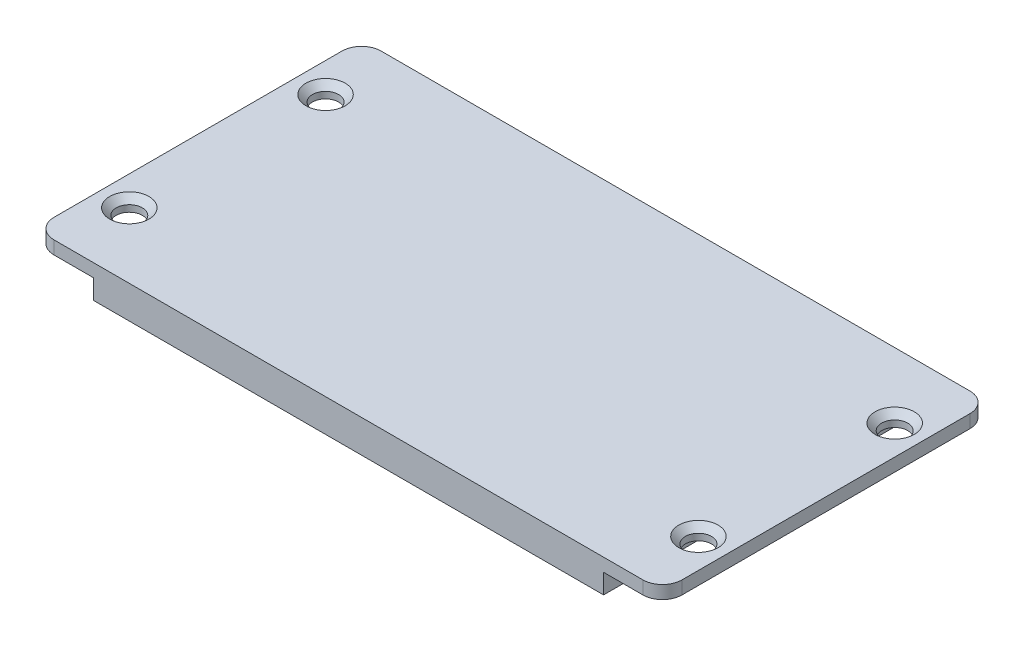
ISO-10303-21;
HEADER;
FILE_DESCRIPTION(('STEP AP214'),'2;1');
FILE_NAME('part.step','',(''),(''),'','','');
FILE_SCHEMA(('AUTOMOTIVE_DESIGN { 1 0 10303 214 1 1 1 1 }'));
ENDSEC;
DATA;
#1=APPLICATION_CONTEXT('core data for automotive mechanical design processes');
#2=APPLICATION_PROTOCOL_DEFINITION('international standard','automotive_design',2000,#1);
#3=PRODUCT_CONTEXT('',#1,'mechanical');
#4=PRODUCT('Part','Part','',(#3));
#5=PRODUCT_RELATED_PRODUCT_CATEGORY('part','',(#4));
#6=PRODUCT_DEFINITION_FORMATION('','',#4);
#7=PRODUCT_DEFINITION_CONTEXT('part definition',#1,'design');
#8=PRODUCT_DEFINITION('design','',#6,#7);
#9=PRODUCT_DEFINITION_SHAPE('','',#8);
#10=(LENGTH_UNIT() NAMED_UNIT(*) SI_UNIT(.MILLI.,.METRE.));
#11=(NAMED_UNIT(*) PLANE_ANGLE_UNIT() SI_UNIT($,.RADIAN.));
#12=(NAMED_UNIT(*) SI_UNIT($,.STERADIAN.) SOLID_ANGLE_UNIT());
#13=UNCERTAINTY_MEASURE_WITH_UNIT(LENGTH_MEASURE(1.E-05),#10,'distance_accuracy_value','');
#14=(GEOMETRIC_REPRESENTATION_CONTEXT(3) GLOBAL_UNCERTAINTY_ASSIGNED_CONTEXT((#13)) GLOBAL_UNIT_ASSIGNED_CONTEXT((#10,
#11,#12)) REPRESENTATION_CONTEXT('',''));
#15=CARTESIAN_POINT('',(0.,0.,0.));
#16=DIRECTION('',(0.,0.,1.));
#17=DIRECTION('',(1.,0.,0.));
#18=AXIS2_PLACEMENT_3D('',#15,#16,#17);
#19=CARTESIAN_POINT('',(45.,-5.,-22.));
#20=DIRECTION('',(0.,1.,0.));
#21=DIRECTION('',(0.,0.,1.));
#22=AXIS2_PLACEMENT_3D('',#19,#20,#21);
#23=CYLINDRICAL_SURFACE('',#22,3.);
#24=DIRECTION('',(0.,1.,0.));
#25=VECTOR('',#24,1.);
#26=CARTESIAN_POINT('',(48.,-5.,-22.));
#27=LINE('',#26,#25);
#28=CARTESIAN_POINT('',(48.,-2.,-22.));
#29=VERTEX_POINT('',#28);
#30=CARTESIAN_POINT('',(48.,0.,-22.));
#31=VERTEX_POINT('',#30);
#32=EDGE_CURVE('E219',#29,#31,#27,.T.);
#33=ORIENTED_EDGE('',*,*,#32,.F.);
#34=CARTESIAN_POINT('',(45.,-2.,-22.));
#35=DIRECTION('',(0.,-1.,0.));
#36=DIRECTION('',(0.,0.,-1.));
#37=AXIS2_PLACEMENT_3D('',#34,#35,#36);
#38=CIRCLE('',#37,3.);
#39=CARTESIAN_POINT('',(45.,-2.,-25.));
#40=VERTEX_POINT('',#39);
#41=EDGE_CURVE('E156',#29,#40,#38,.F.);
#42=ORIENTED_EDGE('',*,*,#41,.T.);
#43=DIRECTION('',(0.,1.,0.));
#44=VECTOR('',#43,1.);
#45=CARTESIAN_POINT('',(45.,-5.,-25.));
#46=LINE('',#45,#44);
#47=CARTESIAN_POINT('',(45.,0.,-25.));
#48=VERTEX_POINT('',#47);
#49=EDGE_CURVE('E142',#40,#48,#46,.T.);
#50=ORIENTED_EDGE('',*,*,#49,.T.);
#51=CARTESIAN_POINT('',(45.,0.,-22.));
#52=DIRECTION('',(0.,1.,0.));
#53=DIRECTION('',(0.,0.,-1.));
#54=AXIS2_PLACEMENT_3D('',#51,#52,#53);
#55=CIRCLE('',#54,3.);
#56=EDGE_CURVE('E200',#31,#48,#55,.T.);
#57=ORIENTED_EDGE('',*,*,#56,.F.);
#58=EDGE_LOOP('',(#33,#42,#50,#57));
#59=FACE_BOUND('',#58,.T.);
#60=ADVANCED_FACE('F33',(#59),#23,.T.);
#61=CARTESIAN_POINT('',(48.,-5.,-22.));
#62=DIRECTION('',(1.,0.,0.));
#63=DIRECTION('',(0.,0.,-1.));
#64=AXIS2_PLACEMENT_3D('',#61,#62,#63);
#65=PLANE('',#64);
#66=DIRECTION('',(0.,1.,0.));
#67=VECTOR('',#66,1.);
#68=CARTESIAN_POINT('',(48.,-5.,22.));
#69=LINE('',#68,#67);
#70=CARTESIAN_POINT('',(48.,-2.,22.));
#71=VERTEX_POINT('',#70);
#72=CARTESIAN_POINT('',(48.,0.,22.));
#73=VERTEX_POINT('',#72);
#74=EDGE_CURVE('E221',#71,#73,#69,.T.);
#75=ORIENTED_EDGE('',*,*,#74,.F.);
#76=DIRECTION('',(0.,0.,1.));
#77=VECTOR('',#76,1.);
#78=CARTESIAN_POINT('',(48.,-2.,25.));
#79=LINE('',#78,#77);
#80=EDGE_CURVE('E143',#29,#71,#79,.T.);
#81=ORIENTED_EDGE('',*,*,#80,.F.);
#82=ORIENTED_EDGE('',*,*,#32,.T.);
#83=DIRECTION('',(0.,0.,-1.));
#84=VECTOR('',#83,1.);
#85=CARTESIAN_POINT('',(48.,0.,-22.));
#86=LINE('',#85,#84);
#87=EDGE_CURVE('E197',#73,#31,#86,.T.);
#88=ORIENTED_EDGE('',*,*,#87,.F.);
#89=EDGE_LOOP('',(#75,#81,#82,#88));
#90=FACE_BOUND('',#89,.T.);
#91=ADVANCED_FACE('F275',(#90),#65,.T.);
#92=CARTESIAN_POINT('',(45.,-5.,22.));
#93=DIRECTION('',(0.,1.,0.));
#94=DIRECTION('',(0.,0.,1.));
#95=AXIS2_PLACEMENT_3D('',#92,#93,#94);
#96=CYLINDRICAL_SURFACE('',#95,3.);
#97=DIRECTION('',(0.,1.,0.));
#98=VECTOR('',#97,1.);
#99=CARTESIAN_POINT('',(45.,-5.,25.));
#100=LINE('',#99,#98);
#101=CARTESIAN_POINT('',(45.,-2.,25.));
#102=VERTEX_POINT('',#101);
#103=CARTESIAN_POINT('',(45.,0.,25.));
#104=VERTEX_POINT('',#103);
#105=EDGE_CURVE('E223',#102,#104,#100,.T.);
#106=ORIENTED_EDGE('',*,*,#105,.F.);
#107=CARTESIAN_POINT('',(45.,-2.,22.));
#108=DIRECTION('',(0.,-1.,0.));
#109=DIRECTION('',(0.,0.,-1.));
#110=AXIS2_PLACEMENT_3D('',#107,#108,#109);
#111=CIRCLE('',#110,3.);
#112=EDGE_CURVE('E153',#102,#71,#111,.F.);
#113=ORIENTED_EDGE('',*,*,#112,.T.);
#114=ORIENTED_EDGE('',*,*,#74,.T.);
#115=CARTESIAN_POINT('',(45.,0.,22.));
#116=DIRECTION('',(0.,1.,0.));
#117=DIRECTION('',(0.,0.,1.));
#118=AXIS2_PLACEMENT_3D('',#115,#116,#117);
#119=CIRCLE('',#118,3.);
#120=EDGE_CURVE('E194',#104,#73,#119,.T.);
#121=ORIENTED_EDGE('',*,*,#120,.F.);
#122=EDGE_LOOP('',(#106,#113,#114,#121));
#123=FACE_BOUND('',#122,.T.);
#124=ADVANCED_FACE('F281',(#123),#96,.T.);
#125=CARTESIAN_POINT('',(43.5,-5.,-15.));
#126=DIRECTION('',(0.,1.,0.));
#127=DIRECTION('',(0.,0.,1.));
#128=AXIS2_PLACEMENT_3D('',#125,#126,#127);
#129=CYLINDRICAL_SURFACE('',#128,2.);
#130=CARTESIAN_POINT('',(43.5,-1.00000000000001,-15.));
#131=DIRECTION('',(0.,1.,0.));
#132=DIRECTION('',(0.,0.,1.));
#133=AXIS2_PLACEMENT_3D('',#130,#131,#132);
#134=CIRCLE('',#133,2.);
#135=CARTESIAN_POINT('',(43.5,-1.00000000000001,-13.));
#136=VERTEX_POINT('',#135);
#137=EDGE_CURVE('E213',#136,#136,#134,.T.);
#138=ORIENTED_EDGE('',*,*,#137,.T.);
#139=EDGE_LOOP('',(#138));
#140=FACE_BOUND('',#139,.T.);
#141=CARTESIAN_POINT('',(43.5,-2.,-15.));
#142=DIRECTION('',(0.,-1.,0.));
#143=DIRECTION('',(0.,0.,-1.));
#144=AXIS2_PLACEMENT_3D('',#141,#142,#143);
#145=CIRCLE('',#144,2.);
#146=CARTESIAN_POINT('',(43.5,-2.,-17.));
#147=VERTEX_POINT('',#146);
#148=EDGE_CURVE('E150',#147,#147,#145,.F.);
#149=ORIENTED_EDGE('',*,*,#148,.F.);
#150=EDGE_LOOP('',(#149));
#151=FACE_BOUND('',#150,.T.);
#152=ADVANCED_FACE('F290',(#140,#151),#129,.F.);
#153=CARTESIAN_POINT('',(43.5,-5.,15.));
#154=DIRECTION('',(0.,1.,0.));
#155=DIRECTION('',(0.,0.,1.));
#156=AXIS2_PLACEMENT_3D('',#153,#154,#155);
#157=CYLINDRICAL_SURFACE('',#156,2.);
#158=CARTESIAN_POINT('',(43.5,-1.00000000000001,15.));
#159=DIRECTION('',(0.,1.,0.));
#160=DIRECTION('',(0.,0.,1.));
#161=AXIS2_PLACEMENT_3D('',#158,#159,#160);
#162=CIRCLE('',#161,2.);
#163=CARTESIAN_POINT('',(43.5,-1.00000000000001,17.));
#164=VERTEX_POINT('',#163);
#165=EDGE_CURVE('E240',#164,#164,#162,.T.);
#166=ORIENTED_EDGE('',*,*,#165,.T.);
#167=EDGE_LOOP('',(#166));
#168=FACE_BOUND('',#167,.T.);
#169=CARTESIAN_POINT('',(43.5,-2.,15.));
#170=DIRECTION('',(0.,-1.,0.));
#171=DIRECTION('',(0.,0.,-1.));
#172=AXIS2_PLACEMENT_3D('',#169,#170,#171);
#173=CIRCLE('',#172,2.);
#174=CARTESIAN_POINT('',(43.5,-2.,13.));
#175=VERTEX_POINT('',#174);
#176=EDGE_CURVE('E37',#175,#175,#173,.F.);
#177=ORIENTED_EDGE('',*,*,#176,.F.);
#178=EDGE_LOOP('',(#177));
#179=FACE_BOUND('',#178,.T.);
#180=ADVANCED_FACE('F301',(#168,#179),#157,.F.);
#181=CARTESIAN_POINT('',(-45.,-5.,22.));
#182=DIRECTION('',(0.,1.,0.));
#183=DIRECTION('',(0.,0.,1.));
#184=AXIS2_PLACEMENT_3D('',#181,#182,#183);
#185=CYLINDRICAL_SURFACE('',#184,3.00000000000001);
#186=CARTESIAN_POINT('',(-45.,-2.,22.));
#187=DIRECTION('',(0.,1.,0.));
#188=DIRECTION('',(0.,0.,1.));
#189=AXIS2_PLACEMENT_3D('',#186,#187,#188);
#190=CIRCLE('',#189,3.00000000000001);
#191=CARTESIAN_POINT('',(-45.,-2.,25.));
#192=VERTEX_POINT('',#191);
#193=CARTESIAN_POINT('',(-48.,-2.,22.));
#194=VERTEX_POINT('',#193);
#195=EDGE_CURVE('E180',#192,#194,#190,.F.);
#196=ORIENTED_EDGE('',*,*,#195,.F.);
#197=DIRECTION('',(0.,1.,0.));
#198=VECTOR('',#197,1.);
#199=CARTESIAN_POINT('',(-45.,-5.,25.));
#200=LINE('',#199,#198);
#201=CARTESIAN_POINT('',(-45.,0.,25.));
#202=VERTEX_POINT('',#201);
#203=EDGE_CURVE('E188',#192,#202,#200,.T.);
#204=ORIENTED_EDGE('',*,*,#203,.T.);
#205=CARTESIAN_POINT('',(-45.,0.,22.));
#206=DIRECTION('',(0.,1.,0.));
#207=DIRECTION('',(0.,0.,1.));
#208=AXIS2_PLACEMENT_3D('',#205,#206,#207);
#209=CIRCLE('',#208,3.00000000000001);
#210=CARTESIAN_POINT('',(-48.,0.,22.));
#211=VERTEX_POINT('',#210);
#212=EDGE_CURVE('E182',#211,#202,#209,.T.);
#213=ORIENTED_EDGE('',*,*,#212,.F.);
#214=DIRECTION('',(0.,1.,0.));
#215=VECTOR('',#214,1.);
#216=CARTESIAN_POINT('',(-48.,-5.,22.));
#217=LINE('',#216,#215);
#218=EDGE_CURVE('E211',#194,#211,#217,.T.);
#219=ORIENTED_EDGE('',*,*,#218,.F.);
#220=EDGE_LOOP('',(#196,#204,#213,#219));
#221=FACE_BOUND('',#220,.T.);
#222=ADVANCED_FACE('F297',(#221),#185,.T.);
#223=CARTESIAN_POINT('',(-48.,-5.,-22.));
#224=DIRECTION('',(-1.,0.,0.));
#225=DIRECTION('',(0.,0.,1.));
#226=AXIS2_PLACEMENT_3D('',#223,#224,#225);
#227=PLANE('',#226);
#228=DIRECTION('',(0.,0.,-1.));
#229=VECTOR('',#228,1.);
#230=CARTESIAN_POINT('',(-48.,-2.,25.));
#231=LINE('',#230,#229);
#232=CARTESIAN_POINT('',(-48.,-2.,-22.));
#233=VERTEX_POINT('',#232);
#234=EDGE_CURVE('E164',#194,#233,#231,.T.);
#235=ORIENTED_EDGE('',*,*,#234,.F.);
#236=ORIENTED_EDGE('',*,*,#218,.T.);
#237=DIRECTION('',(0.,0.,1.));
#238=VECTOR('',#237,1.);
#239=CARTESIAN_POINT('',(-48.,0.,-22.));
#240=LINE('',#239,#238);
#241=CARTESIAN_POINT('',(-48.,0.,-22.));
#242=VERTEX_POINT('',#241);
#243=EDGE_CURVE('E186',#242,#211,#240,.T.);
#244=ORIENTED_EDGE('',*,*,#243,.F.);
#245=DIRECTION('',(0.,1.,0.));
#246=VECTOR('',#245,1.);
#247=CARTESIAN_POINT('',(-48.,-5.,-22.));
#248=LINE('',#247,#246);
#249=EDGE_CURVE('E214',#233,#242,#248,.T.);
#250=ORIENTED_EDGE('',*,*,#249,.F.);
#251=EDGE_LOOP('',(#235,#236,#244,#250));
#252=FACE_BOUND('',#251,.T.);
#253=ADVANCED_FACE('F300',(#252),#227,.T.);
#254=CARTESIAN_POINT('',(-45.,-5.,-22.));
#255=DIRECTION('',(0.,1.,0.));
#256=DIRECTION('',(0.,0.,1.));
#257=AXIS2_PLACEMENT_3D('',#254,#255,#256);
#258=CYLINDRICAL_SURFACE('',#257,3.);
#259=CARTESIAN_POINT('',(-45.,-2.,-22.));
#260=DIRECTION('',(0.,1.,0.));
#261=DIRECTION('',(0.,0.,1.));
#262=AXIS2_PLACEMENT_3D('',#259,#260,#261);
#263=CIRCLE('',#262,3.);
#264=CARTESIAN_POINT('',(-45.,-2.,-25.));
#265=VERTEX_POINT('',#264);
#266=EDGE_CURVE('E178',#233,#265,#263,.F.);
#267=ORIENTED_EDGE('',*,*,#266,.F.);
#268=ORIENTED_EDGE('',*,*,#249,.T.);
#269=CARTESIAN_POINT('',(-45.,0.,-22.));
#270=DIRECTION('',(0.,1.,0.));
#271=DIRECTION('',(0.,0.,1.));
#272=AXIS2_PLACEMENT_3D('',#269,#270,#271);
#273=CIRCLE('',#272,3.);
#274=CARTESIAN_POINT('',(-45.,0.,-25.));
#275=VERTEX_POINT('',#274);
#276=EDGE_CURVE('E206',#275,#242,#273,.T.);
#277=ORIENTED_EDGE('',*,*,#276,.F.);
#278=DIRECTION('',(0.,1.,0.));
#279=VECTOR('',#278,1.);
#280=CARTESIAN_POINT('',(-45.,-5.,-25.));
#281=LINE('',#280,#279);
#282=EDGE_CURVE('E216',#265,#275,#281,.T.);
#283=ORIENTED_EDGE('',*,*,#282,.F.);
#284=EDGE_LOOP('',(#267,#268,#277,#283));
#285=FACE_BOUND('',#284,.T.);
#286=ADVANCED_FACE('F343',(#285),#258,.T.);
#287=CARTESIAN_POINT('',(-45.,-5.,-25.));
#288=DIRECTION('',(0.,0.,-1.));
#289=DIRECTION('',(-1.,0.,0.));
#290=AXIS2_PLACEMENT_3D('',#287,#288,#289);
#291=PLANE('',#290);
#292=DIRECTION('',(0.,-1.,0.));
#293=VECTOR('',#292,1.);
#294=CARTESIAN_POINT('',(39.,-2.,-25.));
#295=LINE('',#294,#293);
#296=CARTESIAN_POINT('',(39.,-2.,-25.));
#297=VERTEX_POINT('',#296);
#298=CARTESIAN_POINT('',(39.,-5.,-25.));
#299=VERTEX_POINT('',#298);
#300=EDGE_CURVE('E124',#297,#299,#295,.T.);
#301=ORIENTED_EDGE('',*,*,#300,.T.);
#302=DIRECTION('',(-1.,0.,0.));
#303=VECTOR('',#302,1.);
#304=CARTESIAN_POINT('',(-45.,-5.,-25.));
#305=LINE('',#304,#303);
#306=CARTESIAN_POINT('',(-39.,-5.,-25.));
#307=VERTEX_POINT('',#306);
#308=EDGE_CURVE('E58',#299,#307,#305,.T.);
#309=ORIENTED_EDGE('',*,*,#308,.T.);
#310=DIRECTION('',(0.,-1.,0.));
#311=VECTOR('',#310,1.);
#312=CARTESIAN_POINT('',(-39.,-2.,-25.));
#313=LINE('',#312,#311);
#314=CARTESIAN_POINT('',(-39.,-2.,-25.));
#315=VERTEX_POINT('',#314);
#316=EDGE_CURVE('E170',#315,#307,#313,.T.);
#317=ORIENTED_EDGE('',*,*,#316,.F.);
#318=DIRECTION('',(1.,0.,0.));
#319=VECTOR('',#318,1.);
#320=CARTESIAN_POINT('',(-39.,-2.,-25.));
#321=LINE('',#320,#319);
#322=EDGE_CURVE('E166',#265,#315,#321,.T.);
#323=ORIENTED_EDGE('',*,*,#322,.F.);
#324=ORIENTED_EDGE('',*,*,#282,.T.);
#325=DIRECTION('',(-1.,0.,0.));
#326=VECTOR('',#325,1.);
#327=CARTESIAN_POINT('',(-45.,0.,-25.));
#328=LINE('',#327,#326);
#329=EDGE_CURVE('E203',#48,#275,#328,.T.);
#330=ORIENTED_EDGE('',*,*,#329,.F.);
#331=ORIENTED_EDGE('',*,*,#49,.F.);
#332=DIRECTION('',(1.,0.,0.));
#333=VECTOR('',#332,1.);
#334=CARTESIAN_POINT('',(39.,-2.,-25.));
#335=LINE('',#334,#333);
#336=EDGE_CURVE('E135',#297,#40,#335,.T.);
#337=ORIENTED_EDGE('',*,*,#336,.F.);
#338=EDGE_LOOP('',(#301,#309,#317,#323,#324,#330,#331,#337));
#339=FACE_BOUND('',#338,.T.);
#340=ADVANCED_FACE('F140',(#339),#291,.T.);
#341=CARTESIAN_POINT('',(-45.,-5.,25.));
#342=DIRECTION('',(0.,0.,1.));
#343=DIRECTION('',(1.,0.,0.));
#344=AXIS2_PLACEMENT_3D('',#341,#342,#343);
#345=PLANE('',#344);
#346=DIRECTION('',(0.,-1.,0.));
#347=VECTOR('',#346,1.);
#348=CARTESIAN_POINT('',(39.,-2.,25.));
#349=LINE('',#348,#347);
#350=CARTESIAN_POINT('',(39.,-2.,25.));
#351=VERTEX_POINT('',#350);
#352=CARTESIAN_POINT('',(39.,-5.,25.));
#353=VERTEX_POINT('',#352);
#354=EDGE_CURVE('E50',#351,#353,#349,.T.);
#355=ORIENTED_EDGE('',*,*,#354,.F.);
#356=DIRECTION('',(-1.,0.,0.));
#357=VECTOR('',#356,1.);
#358=CARTESIAN_POINT('',(39.,-2.,25.));
#359=LINE('',#358,#357);
#360=EDGE_CURVE('E130',#102,#351,#359,.T.);
#361=ORIENTED_EDGE('',*,*,#360,.F.);
#362=ORIENTED_EDGE('',*,*,#105,.T.);
#363=DIRECTION('',(1.,0.,0.));
#364=VECTOR('',#363,1.);
#365=CARTESIAN_POINT('',(-45.,0.,25.));
#366=LINE('',#365,#364);
#367=EDGE_CURVE('E191',#202,#104,#366,.T.);
#368=ORIENTED_EDGE('',*,*,#367,.F.);
#369=ORIENTED_EDGE('',*,*,#203,.F.);
#370=DIRECTION('',(-1.,0.,0.));
#371=VECTOR('',#370,1.);
#372=CARTESIAN_POINT('',(-39.,-2.,25.));
#373=LINE('',#372,#371);
#374=CARTESIAN_POINT('',(-39.,-2.,25.));
#375=VERTEX_POINT('',#374);
#376=EDGE_CURVE('E162',#375,#192,#373,.T.);
#377=ORIENTED_EDGE('',*,*,#376,.F.);
#378=DIRECTION('',(0.,-1.,0.));
#379=VECTOR('',#378,1.);
#380=CARTESIAN_POINT('',(-39.,-2.,25.));
#381=LINE('',#380,#379);
#382=CARTESIAN_POINT('',(-39.,-5.,25.));
#383=VERTEX_POINT('',#382);
#384=EDGE_CURVE('E168',#375,#383,#381,.T.);
#385=ORIENTED_EDGE('',*,*,#384,.T.);
#386=DIRECTION('',(1.,0.,0.));
#387=VECTOR('',#386,1.);
#388=CARTESIAN_POINT('',(-45.,-5.,25.));
#389=LINE('',#388,#387);
#390=EDGE_CURVE('E183',#383,#353,#389,.T.);
#391=ORIENTED_EDGE('',*,*,#390,.T.);
#392=EDGE_LOOP('',(#355,#361,#362,#368,#369,#377,#385,#391));
#393=FACE_BOUND('',#392,.T.);
#394=ADVANCED_FACE('F292',(#393),#345,.T.);
#395=CARTESIAN_POINT('',(-45.,-5.,22.));
#396=DIRECTION('',(0.,1.,0.));
#397=DIRECTION('',(0.,0.,1.));
#398=AXIS2_PLACEMENT_3D('',#395,#396,#397);
#399=PLANE('',#398);
#400=ORIENTED_EDGE('',*,*,#308,.F.);
#401=DIRECTION('',(0.,0.,-1.));
#402=VECTOR('',#401,1.);
#403=CARTESIAN_POINT('',(39.,-5.,25.));
#404=LINE('',#403,#402);
#405=EDGE_CURVE('E128',#353,#299,#404,.T.);
#406=ORIENTED_EDGE('',*,*,#405,.F.);
#407=ORIENTED_EDGE('',*,*,#390,.F.);
#408=DIRECTION('',(0.,0.,1.));
#409=VECTOR('',#408,1.);
#410=CARTESIAN_POINT('',(-39.,-5.,25.));
#411=LINE('',#410,#409);
#412=EDGE_CURVE('E158',#307,#383,#411,.T.);
#413=ORIENTED_EDGE('',*,*,#412,.F.);
#414=EDGE_LOOP('',(#400,#406,#407,#413));
#415=FACE_BOUND('',#414,.T.);
#416=ADVANCED_FACE('F295',(#415),#399,.F.);
#417=CARTESIAN_POINT('',(-45.,0.,22.));
#418=DIRECTION('',(0.,1.,0.));
#419=DIRECTION('',(0.,0.,1.));
#420=AXIS2_PLACEMENT_3D('',#417,#418,#419);
#421=PLANE('',#420);
#422=CARTESIAN_POINT('',(43.5,0.,-15.));
#423=DIRECTION('',(0.,1.,0.));
#424=DIRECTION('',(0.,0.,1.));
#425=AXIS2_PLACEMENT_3D('',#422,#423,#424);
#426=CIRCLE('',#425,3.00000000000002);
#427=CARTESIAN_POINT('',(43.5,0.,-12.));
#428=VERTEX_POINT('',#427);
#429=EDGE_CURVE('E237',#428,#428,#426,.F.);
#430=ORIENTED_EDGE('',*,*,#429,.T.);
#431=EDGE_LOOP('',(#430));
#432=FACE_BOUND('',#431,.T.);
#433=CARTESIAN_POINT('',(43.5,0.,15.));
#434=DIRECTION('',(0.,1.,0.));
#435=DIRECTION('',(0.,0.,1.));
#436=AXIS2_PLACEMENT_3D('',#433,#434,#435);
#437=CIRCLE('',#436,3.00000000000002);
#438=CARTESIAN_POINT('',(43.5,0.,18.));
#439=VERTEX_POINT('',#438);
#440=EDGE_CURVE('E234',#439,#439,#437,.F.);
#441=ORIENTED_EDGE('',*,*,#440,.T.);
#442=EDGE_LOOP('',(#441));
#443=FACE_BOUND('',#442,.T.);
#444=CARTESIAN_POINT('',(-43.5,0.,15.));
#445=DIRECTION('',(0.,1.,0.));
#446=DIRECTION('',(0.,0.,1.));
#447=AXIS2_PLACEMENT_3D('',#444,#445,#446);
#448=CIRCLE('',#447,3.00000000000002);
#449=CARTESIAN_POINT('',(-43.5,0.,18.));
#450=VERTEX_POINT('',#449);
#451=EDGE_CURVE('E231',#450,#450,#448,.F.);
#452=ORIENTED_EDGE('',*,*,#451,.T.);
#453=EDGE_LOOP('',(#452));
#454=FACE_BOUND('',#453,.T.);
#455=CARTESIAN_POINT('',(-43.5,0.,-15.));
#456=DIRECTION('',(0.,1.,0.));
#457=DIRECTION('',(0.,0.,1.));
#458=AXIS2_PLACEMENT_3D('',#455,#456,#457);
#459=CIRCLE('',#458,3.00000000000002);
#460=CARTESIAN_POINT('',(-43.5,0.,-12.));
#461=VERTEX_POINT('',#460);
#462=EDGE_CURVE('E228',#461,#461,#459,.F.);
#463=ORIENTED_EDGE('',*,*,#462,.T.);
#464=EDGE_LOOP('',(#463));
#465=FACE_BOUND('',#464,.T.);
#466=ORIENTED_EDGE('',*,*,#212,.T.);
#467=ORIENTED_EDGE('',*,*,#367,.T.);
#468=ORIENTED_EDGE('',*,*,#120,.T.);
#469=ORIENTED_EDGE('',*,*,#87,.T.);
#470=ORIENTED_EDGE('',*,*,#56,.T.);
#471=ORIENTED_EDGE('',*,*,#329,.T.);
#472=ORIENTED_EDGE('',*,*,#276,.T.);
#473=ORIENTED_EDGE('',*,*,#243,.T.);
#474=EDGE_LOOP('',(#466,#467,#468,#469,#470,#471,#472,#473));
#475=FACE_BOUND('',#474,.T.);
#476=ADVANCED_FACE('F261',(#432,#443,#454,#465,#475),#421,.T.);
#477=CARTESIAN_POINT('',(-43.5,-5.,-15.));
#478=DIRECTION('',(0.,1.,0.));
#479=DIRECTION('',(0.,0.,1.));
#480=AXIS2_PLACEMENT_3D('',#477,#478,#479);
#481=CYLINDRICAL_SURFACE('',#480,2.);
#482=CARTESIAN_POINT('',(-43.5,-2.,-15.));
#483=DIRECTION('',(0.,1.,0.));
#484=DIRECTION('',(0.,0.,1.));
#485=AXIS2_PLACEMENT_3D('',#482,#483,#484);
#486=CIRCLE('',#485,2.);
#487=CARTESIAN_POINT('',(-43.5,-2.,-13.));
#488=VERTEX_POINT('',#487);
#489=EDGE_CURVE('E175',#488,#488,#486,.F.);
#490=ORIENTED_EDGE('',*,*,#489,.T.);
#491=EDGE_LOOP('',(#490));
#492=FACE_BOUND('',#491,.T.);
#493=CARTESIAN_POINT('',(-43.5,-1.00000000000001,-15.));
#494=DIRECTION('',(0.,1.,0.));
#495=DIRECTION('',(0.,0.,1.));
#496=AXIS2_PLACEMENT_3D('',#493,#494,#495);
#497=CIRCLE('',#496,2.);
#498=CARTESIAN_POINT('',(-43.5,-1.00000000000001,-13.));
#499=VERTEX_POINT('',#498);
#500=EDGE_CURVE('E11',#499,#499,#497,.T.);
#501=ORIENTED_EDGE('',*,*,#500,.T.);
#502=EDGE_LOOP('',(#501));
#503=FACE_BOUND('',#502,.T.);
#504=ADVANCED_FACE('F258',(#492,#503),#481,.F.);
#505=CARTESIAN_POINT('',(-43.5,-5.,15.));
#506=DIRECTION('',(0.,1.,0.));
#507=DIRECTION('',(0.,0.,1.));
#508=AXIS2_PLACEMENT_3D('',#505,#506,#507);
#509=CYLINDRICAL_SURFACE('',#508,2.);
#510=CARTESIAN_POINT('',(-43.5,-2.,15.));
#511=DIRECTION('',(0.,1.,0.));
#512=DIRECTION('',(0.,0.,1.));
#513=AXIS2_PLACEMENT_3D('',#510,#511,#512);
#514=CIRCLE('',#513,2.);
#515=CARTESIAN_POINT('',(-43.5,-2.,17.));
#516=VERTEX_POINT('',#515);
#517=EDGE_CURVE('E172',#516,#516,#514,.F.);
#518=ORIENTED_EDGE('',*,*,#517,.T.);
#519=EDGE_LOOP('',(#518));
#520=FACE_BOUND('',#519,.T.);
#521=CARTESIAN_POINT('',(-43.5,-1.00000000000001,15.));
#522=DIRECTION('',(0.,1.,0.));
#523=DIRECTION('',(0.,0.,1.));
#524=AXIS2_PLACEMENT_3D('',#521,#522,#523);
#525=CIRCLE('',#524,2.);
#526=CARTESIAN_POINT('',(-43.5,-1.00000000000001,17.));
#527=VERTEX_POINT('',#526);
#528=EDGE_CURVE('E42',#527,#527,#525,.T.);
#529=ORIENTED_EDGE('',*,*,#528,.T.);
#530=EDGE_LOOP('',(#529));
#531=FACE_BOUND('',#530,.T.);
#532=ADVANCED_FACE('F247',(#520,#531),#509,.F.);
#533=CARTESIAN_POINT('',(43.5,-1.00000000000001,-15.));
#534=DIRECTION('',(0.,1.,0.));
#535=DIRECTION('',(0.,0.,1.));
#536=AXIS2_PLACEMENT_3D('',#533,#534,#535);
#537=CONICAL_SURFACE('',#536,2.,0.785398163397453);
#538=ORIENTED_EDGE('',*,*,#429,.F.);
#539=EDGE_LOOP('',(#538));
#540=FACE_BOUND('',#539,.T.);
#541=ORIENTED_EDGE('',*,*,#137,.F.);
#542=EDGE_LOOP('',(#541));
#543=FACE_BOUND('',#542,.T.);
#544=ADVANCED_FACE('F303',(#540,#543),#537,.F.);
#545=CARTESIAN_POINT('',(43.5,-1.00000000000001,15.));
#546=DIRECTION('',(0.,1.,0.));
#547=DIRECTION('',(0.,0.,1.));
#548=AXIS2_PLACEMENT_3D('',#545,#546,#547);
#549=CONICAL_SURFACE('',#548,2.,0.785398163397452);
#550=ORIENTED_EDGE('',*,*,#440,.F.);
#551=EDGE_LOOP('',(#550));
#552=FACE_BOUND('',#551,.T.);
#553=ORIENTED_EDGE('',*,*,#165,.F.);
#554=EDGE_LOOP('',(#553));
#555=FACE_BOUND('',#554,.T.);
#556=ADVANCED_FACE('F271',(#552,#555),#549,.F.);
#557=CARTESIAN_POINT('',(-43.5,-1.00000000000001,15.));
#558=DIRECTION('',(0.,1.,0.));
#559=DIRECTION('',(0.,0.,1.));
#560=AXIS2_PLACEMENT_3D('',#557,#558,#559);
#561=CONICAL_SURFACE('',#560,2.,0.785398163397453);
#562=ORIENTED_EDGE('',*,*,#451,.F.);
#563=EDGE_LOOP('',(#562));
#564=FACE_BOUND('',#563,.T.);
#565=ORIENTED_EDGE('',*,*,#528,.F.);
#566=EDGE_LOOP('',(#565));
#567=FACE_BOUND('',#566,.T.);
#568=ADVANCED_FACE('F266',(#564,#567),#561,.F.);
#569=CARTESIAN_POINT('',(-43.5,-1.00000000000001,-15.));
#570=DIRECTION('',(0.,1.,0.));
#571=DIRECTION('',(0.,0.,1.));
#572=AXIS2_PLACEMENT_3D('',#569,#570,#571);
#573=CONICAL_SURFACE('',#572,2.,0.785398163397453);
#574=ORIENTED_EDGE('',*,*,#462,.F.);
#575=EDGE_LOOP('',(#574));
#576=FACE_BOUND('',#575,.T.);
#577=ORIENTED_EDGE('',*,*,#500,.F.);
#578=EDGE_LOOP('',(#577));
#579=FACE_BOUND('',#578,.T.);
#580=ADVANCED_FACE('F35',(#576,#579),#573,.F.);
#581=CARTESIAN_POINT('',(0.,-2.,0.));
#582=DIRECTION('',(0.,1.,0.));
#583=DIRECTION('',(0.,0.,1.));
#584=AXIS2_PLACEMENT_3D('',#581,#582,#583);
#585=PLANE('',#584);
#586=ORIENTED_EDGE('',*,*,#195,.T.);
#587=ORIENTED_EDGE('',*,*,#234,.T.);
#588=ORIENTED_EDGE('',*,*,#266,.T.);
#589=ORIENTED_EDGE('',*,*,#322,.T.);
#590=DIRECTION('',(0.,0.,1.));
#591=VECTOR('',#590,1.);
#592=CARTESIAN_POINT('',(-39.,-2.,25.));
#593=LINE('',#592,#591);
#594=EDGE_CURVE('E159',#315,#375,#593,.T.);
#595=ORIENTED_EDGE('',*,*,#594,.T.);
#596=ORIENTED_EDGE('',*,*,#376,.T.);
#597=EDGE_LOOP('',(#586,#587,#588,#589,#595,#596));
#598=FACE_BOUND('',#597,.T.);
#599=ORIENTED_EDGE('',*,*,#517,.F.);
#600=EDGE_LOOP('',(#599));
#601=FACE_BOUND('',#600,.T.);
#602=ORIENTED_EDGE('',*,*,#489,.F.);
#603=EDGE_LOOP('',(#602));
#604=FACE_BOUND('',#603,.T.);
#605=ADVANCED_FACE('F250',(#598,#601,#604),#585,.F.);
#606=CARTESIAN_POINT('',(-39.,-2.,25.));
#607=DIRECTION('',(1.,0.,0.));
#608=DIRECTION('',(0.,0.,-1.));
#609=AXIS2_PLACEMENT_3D('',#606,#607,#608);
#610=PLANE('',#609);
#611=ORIENTED_EDGE('',*,*,#412,.T.);
#612=ORIENTED_EDGE('',*,*,#384,.F.);
#613=ORIENTED_EDGE('',*,*,#594,.F.);
#614=ORIENTED_EDGE('',*,*,#316,.T.);
#615=EDGE_LOOP('',(#611,#612,#613,#614));
#616=FACE_BOUND('',#615,.T.);
#617=ADVANCED_FACE('F253',(#616),#610,.F.);
#618=CARTESIAN_POINT('',(0.,-2.,0.));
#619=DIRECTION('',(0.,-1.,0.));
#620=DIRECTION('',(0.,0.,-1.));
#621=AXIS2_PLACEMENT_3D('',#618,#619,#620);
#622=PLANE('',#621);
#623=ORIENTED_EDGE('',*,*,#176,.T.);
#624=EDGE_LOOP('',(#623));
#625=FACE_BOUND('',#624,.T.);
#626=ORIENTED_EDGE('',*,*,#80,.T.);
#627=ORIENTED_EDGE('',*,*,#112,.F.);
#628=ORIENTED_EDGE('',*,*,#360,.T.);
#629=DIRECTION('',(0.,0.,-1.));
#630=VECTOR('',#629,1.);
#631=CARTESIAN_POINT('',(39.,-2.,25.));
#632=LINE('',#631,#630);
#633=EDGE_CURVE('E127',#351,#297,#632,.T.);
#634=ORIENTED_EDGE('',*,*,#633,.T.);
#635=ORIENTED_EDGE('',*,*,#336,.T.);
#636=ORIENTED_EDGE('',*,*,#41,.F.);
#637=EDGE_LOOP('',(#626,#627,#628,#634,#635,#636));
#638=FACE_BOUND('',#637,.T.);
#639=ORIENTED_EDGE('',*,*,#148,.T.);
#640=EDGE_LOOP('',(#639));
#641=FACE_BOUND('',#640,.T.);
#642=ADVANCED_FACE('F133',(#625,#638,#641),#622,.T.);
#643=CARTESIAN_POINT('',(39.,-2.,25.));
#644=DIRECTION('',(-1.,0.,0.));
#645=DIRECTION('',(0.,0.,1.));
#646=AXIS2_PLACEMENT_3D('',#643,#644,#645);
#647=PLANE('',#646);
#648=ORIENTED_EDGE('',*,*,#405,.T.);
#649=ORIENTED_EDGE('',*,*,#300,.F.);
#650=ORIENTED_EDGE('',*,*,#633,.F.);
#651=ORIENTED_EDGE('',*,*,#354,.T.);
#652=EDGE_LOOP('',(#648,#649,#650,#651));
#653=FACE_BOUND('',#652,.T.);
#654=ADVANCED_FACE('F126',(#653),#647,.F.);
#655=CLOSED_SHELL('',(#60,#91,#124,#152,#180,#222,#253,#286,#340,#394,#416,#476,#504,#532,#544,
#556,#568,#580,#605,#617,#642,#654));
#656=MANIFOLD_SOLID_BREP('B2',#655);
#657=ADVANCED_BREP_SHAPE_REPRESENTATION('',(#18,#656),#14);
#658=SHAPE_DEFINITION_REPRESENTATION(#9,#657);
ENDSEC;
END-ISO-10303-21;
